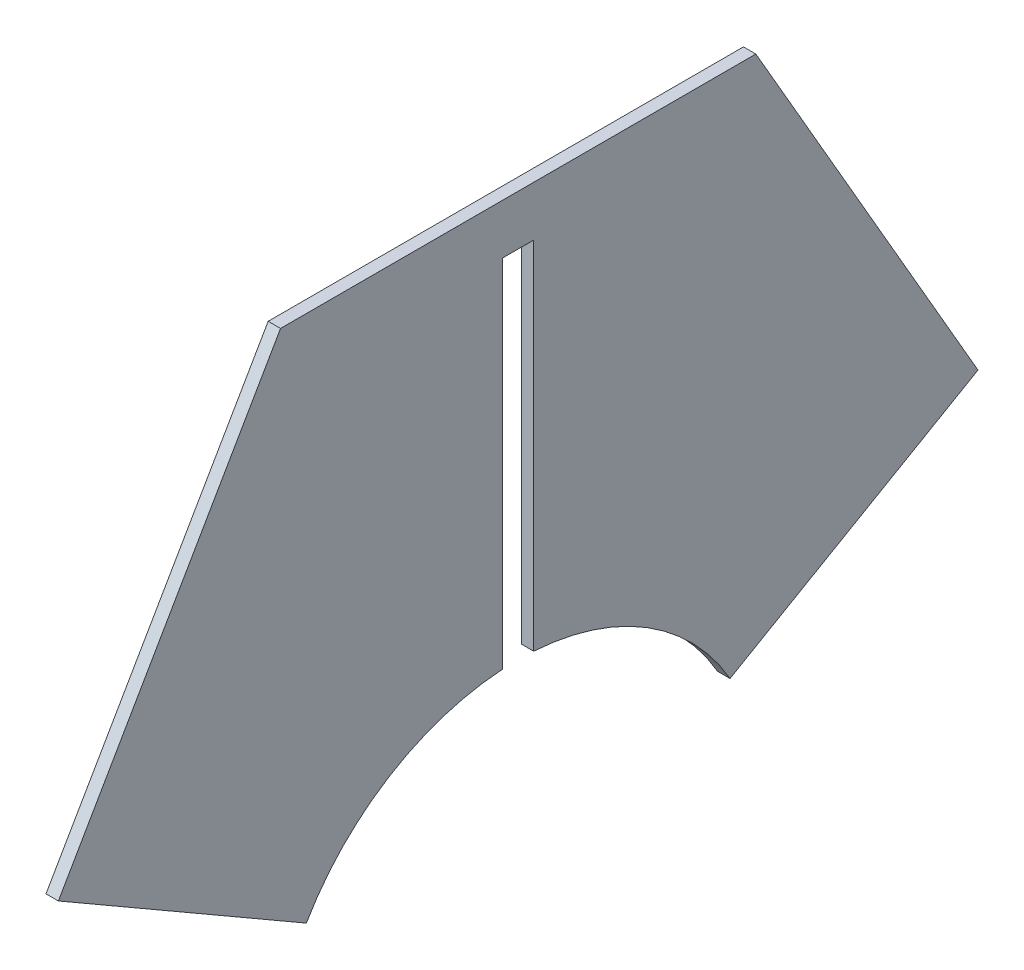
ISO-10303-21;
HEADER;
FILE_DESCRIPTION(('STEP AP214'),'2;1');
FILE_NAME('part.step','',(''),(''),'','','');
FILE_SCHEMA(('AUTOMOTIVE_DESIGN { 1 0 10303 214 1 1 1 1 }'));
ENDSEC;
DATA;
#1=APPLICATION_CONTEXT('core data for automotive mechanical design processes');
#2=APPLICATION_PROTOCOL_DEFINITION('international standard','automotive_design',2000,#1);
#3=PRODUCT_CONTEXT('',#1,'mechanical');
#4=PRODUCT('Part','Part','',(#3));
#5=PRODUCT_RELATED_PRODUCT_CATEGORY('part','',(#4));
#6=PRODUCT_DEFINITION_FORMATION('','',#4);
#7=PRODUCT_DEFINITION_CONTEXT('part definition',#1,'design');
#8=PRODUCT_DEFINITION('design','',#6,#7);
#9=PRODUCT_DEFINITION_SHAPE('','',#8);
#10=(LENGTH_UNIT() NAMED_UNIT(*) SI_UNIT(.MILLI.,.METRE.));
#11=(NAMED_UNIT(*) PLANE_ANGLE_UNIT() SI_UNIT($,.RADIAN.));
#12=(NAMED_UNIT(*) SI_UNIT($,.STERADIAN.) SOLID_ANGLE_UNIT());
#13=UNCERTAINTY_MEASURE_WITH_UNIT(LENGTH_MEASURE(1.E-05),#10,'distance_accuracy_value','');
#14=(GEOMETRIC_REPRESENTATION_CONTEXT(3) GLOBAL_UNCERTAINTY_ASSIGNED_CONTEXT((#13)) GLOBAL_UNIT_ASSIGNED_CONTEXT((#10,
#11,#12)) REPRESENTATION_CONTEXT('',''));
#15=CARTESIAN_POINT('',(0.,0.,0.));
#16=DIRECTION('',(0.,0.,1.));
#17=DIRECTION('',(1.,0.,0.));
#18=AXIS2_PLACEMENT_3D('',#15,#16,#17);
#19=CARTESIAN_POINT('',(4.,0.,0.));
#20=DIRECTION('',(-1.,0.,0.));
#21=DIRECTION('',(0.,0.,1.));
#22=AXIS2_PLACEMENT_3D('',#19,#20,#21);
#23=CYLINDRICAL_SURFACE('',#22,79.);
#24=CARTESIAN_POINT('',(0.,0.,0.));
#25=DIRECTION('',(-1.,0.,0.));
#26=DIRECTION('',(0.,0.,1.));
#27=AXIS2_PLACEMENT_3D('',#24,#25,#26);
#28=CIRCLE('',#27,79.);
#29=CARTESIAN_POINT('',(0.,39.5000000000003,68.4160068989705));
#30=VERTEX_POINT('',#29);
#31=CARTESIAN_POINT('',(0.,78.8416133777081,5.));
#32=VERTEX_POINT('',#31);
#33=EDGE_CURVE('E142',#30,#32,#28,.T.);
#34=ORIENTED_EDGE('',*,*,#33,.T.);
#35=DIRECTION('',(-1.,0.,0.));
#36=VECTOR('',#35,1.);
#37=CARTESIAN_POINT('',(4.,78.8416133777081,5.));
#38=LINE('',#37,#36);
#39=CARTESIAN_POINT('',(4.,78.8416133777081,5.));
#40=VERTEX_POINT('',#39);
#41=EDGE_CURVE('E11',#40,#32,#38,.T.);
#42=ORIENTED_EDGE('',*,*,#41,.F.);
#43=CARTESIAN_POINT('',(4.,0.,0.));
#44=DIRECTION('',(-1.,0.,0.));
#45=DIRECTION('',(0.,0.,1.));
#46=AXIS2_PLACEMENT_3D('',#43,#44,#45);
#47=CIRCLE('',#46,79.);
#48=CARTESIAN_POINT('',(4.,39.5000000000003,68.4160068989705));
#49=VERTEX_POINT('',#48);
#50=EDGE_CURVE('E160',#49,#40,#47,.T.);
#51=ORIENTED_EDGE('',*,*,#50,.F.);
#52=DIRECTION('',(-1.,0.,0.));
#53=VECTOR('',#52,1.);
#54=CARTESIAN_POINT('',(4.,39.5000000000003,68.4160068989705));
#55=LINE('',#54,#53);
#56=EDGE_CURVE('E138',#49,#30,#55,.T.);
#57=ORIENTED_EDGE('',*,*,#56,.T.);
#58=EDGE_LOOP('',(#34,#42,#51,#57));
#59=FACE_BOUND('',#58,.T.);
#60=ADVANCED_FACE('F34',(#59),#23,.F.);
#61=CARTESIAN_POINT('',(4.,78.8416133777081,5.));
#62=DIRECTION('',(0.,0.,1.));
#63=DIRECTION('',(1.,0.,0.));
#64=AXIS2_PLACEMENT_3D('',#61,#62,#63);
#65=PLANE('',#64);
#66=DIRECTION('',(0.,1.,0.));
#67=VECTOR('',#66,1.);
#68=CARTESIAN_POINT('',(0.,78.8416133777081,5.));
#69=LINE('',#68,#67);
#70=CARTESIAN_POINT('',(0.,193.841613377708,5.));
#71=VERTEX_POINT('',#70);
#72=EDGE_CURVE('E145',#32,#71,#69,.T.);
#73=ORIENTED_EDGE('',*,*,#72,.T.);
#74=DIRECTION('',(-1.,0.,0.));
#75=VECTOR('',#74,1.);
#76=CARTESIAN_POINT('',(4.,193.841613377708,5.));
#77=LINE('',#76,#75);
#78=CARTESIAN_POINT('',(4.,193.841613377708,5.));
#79=VERTEX_POINT('',#78);
#80=EDGE_CURVE('E42',#79,#71,#77,.T.);
#81=ORIENTED_EDGE('',*,*,#80,.F.);
#82=DIRECTION('',(0.,1.,0.));
#83=VECTOR('',#82,1.);
#84=CARTESIAN_POINT('',(4.,78.8416133777081,5.));
#85=LINE('',#84,#83);
#86=EDGE_CURVE('E99',#40,#79,#85,.T.);
#87=ORIENTED_EDGE('',*,*,#86,.F.);
#88=ORIENTED_EDGE('',*,*,#41,.T.);
#89=EDGE_LOOP('',(#73,#81,#87,#88));
#90=FACE_BOUND('',#89,.T.);
#91=ADVANCED_FACE('F209',(#90),#65,.F.);
#92=CARTESIAN_POINT('',(4.,193.841613377708,5.));
#93=DIRECTION('',(0.,1.,0.));
#94=DIRECTION('',(0.,0.,1.));
#95=AXIS2_PLACEMENT_3D('',#92,#93,#94);
#96=PLANE('',#95);
#97=DIRECTION('',(0.,0.,-1.));
#98=VECTOR('',#97,1.);
#99=CARTESIAN_POINT('',(0.,193.841613377708,5.));
#100=LINE('',#99,#98);
#101=CARTESIAN_POINT('',(0.,193.841613377708,-5.));
#102=VERTEX_POINT('',#101);
#103=EDGE_CURVE('E147',#71,#102,#100,.T.);
#104=ORIENTED_EDGE('',*,*,#103,.T.);
#105=DIRECTION('',(-1.,0.,0.));
#106=VECTOR('',#105,1.);
#107=CARTESIAN_POINT('',(4.,193.841613377708,-5.));
#108=LINE('',#107,#106);
#109=CARTESIAN_POINT('',(4.,193.841613377708,-5.));
#110=VERTEX_POINT('',#109);
#111=EDGE_CURVE('E173',#110,#102,#108,.T.);
#112=ORIENTED_EDGE('',*,*,#111,.F.);
#113=DIRECTION('',(0.,0.,-1.));
#114=VECTOR('',#113,1.);
#115=CARTESIAN_POINT('',(4.,193.841613377708,5.));
#116=LINE('',#115,#114);
#117=EDGE_CURVE('E181',#79,#110,#116,.T.);
#118=ORIENTED_EDGE('',*,*,#117,.F.);
#119=ORIENTED_EDGE('',*,*,#80,.T.);
#120=EDGE_LOOP('',(#104,#112,#118,#119));
#121=FACE_BOUND('',#120,.T.);
#122=ADVANCED_FACE('F179',(#121),#96,.F.);
#123=CARTESIAN_POINT('',(4.,193.841613377708,-5.));
#124=DIRECTION('',(0.,0.,-1.));
#125=DIRECTION('',(-1.,0.,0.));
#126=AXIS2_PLACEMENT_3D('',#123,#124,#125);
#127=PLANE('',#126);
#128=DIRECTION('',(0.,-1.,0.));
#129=VECTOR('',#128,1.);
#130=CARTESIAN_POINT('',(0.,193.841613377708,-5.));
#131=LINE('',#130,#129);
#132=CARTESIAN_POINT('',(0.,78.8416133777081,-5.));
#133=VERTEX_POINT('',#132);
#134=EDGE_CURVE('E149',#102,#133,#131,.T.);
#135=ORIENTED_EDGE('',*,*,#134,.T.);
#136=DIRECTION('',(-1.,0.,0.));
#137=VECTOR('',#136,1.);
#138=CARTESIAN_POINT('',(4.,78.8416133777081,-5.));
#139=LINE('',#138,#137);
#140=CARTESIAN_POINT('',(4.,78.8416133777081,-5.));
#141=VERTEX_POINT('',#140);
#142=EDGE_CURVE('E170',#141,#133,#139,.T.);
#143=ORIENTED_EDGE('',*,*,#142,.F.);
#144=DIRECTION('',(0.,-1.,0.));
#145=VECTOR('',#144,1.);
#146=CARTESIAN_POINT('',(4.,193.841613377708,-5.));
#147=LINE('',#146,#145);
#148=EDGE_CURVE('E199',#110,#141,#147,.T.);
#149=ORIENTED_EDGE('',*,*,#148,.F.);
#150=ORIENTED_EDGE('',*,*,#111,.T.);
#151=EDGE_LOOP('',(#135,#143,#149,#150));
#152=FACE_BOUND('',#151,.T.);
#153=ADVANCED_FACE('F190',(#152),#127,.F.);
#154=CARTESIAN_POINT('',(4.,0.,0.));
#155=DIRECTION('',(-1.,0.,0.));
#156=DIRECTION('',(0.,0.,1.));
#157=AXIS2_PLACEMENT_3D('',#154,#155,#156);
#158=CYLINDRICAL_SURFACE('',#157,79.);
#159=CARTESIAN_POINT('',(0.,0.,0.));
#160=DIRECTION('',(-1.,0.,0.));
#161=DIRECTION('',(0.,0.,-1.));
#162=AXIS2_PLACEMENT_3D('',#159,#160,#161);
#163=CIRCLE('',#162,79.);
#164=CARTESIAN_POINT('',(0.,39.4999999999998,-68.4160068989707));
#165=VERTEX_POINT('',#164);
#166=EDGE_CURVE('E151',#133,#165,#163,.T.);
#167=ORIENTED_EDGE('',*,*,#166,.T.);
#168=DIRECTION('',(-1.,0.,0.));
#169=VECTOR('',#168,1.);
#170=CARTESIAN_POINT('',(4.,39.4999999999998,-68.4160068989707));
#171=LINE('',#170,#169);
#172=CARTESIAN_POINT('',(4.,39.4999999999998,-68.4160068989707));
#173=VERTEX_POINT('',#172);
#174=EDGE_CURVE('E167',#173,#165,#171,.T.);
#175=ORIENTED_EDGE('',*,*,#174,.F.);
#176=CARTESIAN_POINT('',(4.,0.,0.));
#177=DIRECTION('',(-1.,0.,0.));
#178=DIRECTION('',(0.,0.,-1.));
#179=AXIS2_PLACEMENT_3D('',#176,#177,#178);
#180=CIRCLE('',#179,79.);
#181=EDGE_CURVE('E196',#141,#173,#180,.T.);
#182=ORIENTED_EDGE('',*,*,#181,.F.);
#183=ORIENTED_EDGE('',*,*,#142,.T.);
#184=EDGE_LOOP('',(#167,#175,#182,#183));
#185=FACE_BOUND('',#184,.T.);
#186=ADVANCED_FACE('F194',(#185),#158,.F.);
#187=CARTESIAN_POINT('',(4.,85.7365149746589,-148.5));
#188=DIRECTION('',(0.,0.86602540378444,0.499999999999998));
#189=DIRECTION('',(0.,-0.499999999999998,0.86602540378444));
#190=AXIS2_PLACEMENT_3D('',#187,#188,#189);
#191=PLANE('',#190);
#192=DIRECTION('',(0.,0.499999999999998,-0.86602540378444));
#193=VECTOR('',#192,1.);
#194=CARTESIAN_POINT('',(0.,85.7365149746589,-148.5));
#195=LINE('',#194,#193);
#196=CARTESIAN_POINT('',(0.,85.7365149746589,-148.5));
#197=VERTEX_POINT('',#196);
#198=EDGE_CURVE('E153',#165,#197,#195,.T.);
#199=ORIENTED_EDGE('',*,*,#198,.T.);
#200=DIRECTION('',(-1.,0.,0.));
#201=VECTOR('',#200,1.);
#202=CARTESIAN_POINT('',(4.,85.7365149746589,-148.5));
#203=LINE('',#202,#201);
#204=CARTESIAN_POINT('',(4.,85.7365149746589,-148.5));
#205=VERTEX_POINT('',#204);
#206=EDGE_CURVE('E164',#205,#197,#203,.T.);
#207=ORIENTED_EDGE('',*,*,#206,.F.);
#208=DIRECTION('',(0.,0.499999999999998,-0.86602540378444));
#209=VECTOR('',#208,1.);
#210=CARTESIAN_POINT('',(4.,85.7365149746589,-148.5));
#211=LINE('',#210,#209);
#212=EDGE_CURVE('E198',#173,#205,#211,.T.);
#213=ORIENTED_EDGE('',*,*,#212,.F.);
#214=ORIENTED_EDGE('',*,*,#174,.T.);
#215=EDGE_LOOP('',(#199,#207,#213,#214));
#216=FACE_BOUND('',#215,.T.);
#217=ADVANCED_FACE('F221',(#216),#191,.F.);
#218=CARTESIAN_POINT('',(4.,210.,-76.7564434701784));
#219=DIRECTION('',(0.,-0.499999999999998,0.86602540378444));
#220=DIRECTION('',(0.,-0.86602540378444,-0.499999999999998));
#221=AXIS2_PLACEMENT_3D('',#218,#219,#220);
#222=PLANE('',#221);
#223=DIRECTION('',(0.,0.86602540378444,0.499999999999998));
#224=VECTOR('',#223,1.);
#225=CARTESIAN_POINT('',(0.,210.,-76.7564434701784));
#226=LINE('',#225,#224);
#227=CARTESIAN_POINT('',(0.,210.,-76.7564434701784));
#228=VERTEX_POINT('',#227);
#229=EDGE_CURVE('E155',#197,#228,#226,.T.);
#230=ORIENTED_EDGE('',*,*,#229,.T.);
#231=DIRECTION('',(-1.,0.,0.));
#232=VECTOR('',#231,1.);
#233=CARTESIAN_POINT('',(4.,210.,-76.7564434701784));
#234=LINE('',#233,#232);
#235=CARTESIAN_POINT('',(4.,210.,-76.7564434701784));
#236=VERTEX_POINT('',#235);
#237=EDGE_CURVE('E133',#236,#228,#234,.T.);
#238=ORIENTED_EDGE('',*,*,#237,.F.);
#239=DIRECTION('',(0.,0.86602540378444,0.499999999999998));
#240=VECTOR('',#239,1.);
#241=CARTESIAN_POINT('',(4.,210.,-76.7564434701784));
#242=LINE('',#241,#240);
#243=EDGE_CURVE('E124',#205,#236,#242,.T.);
#244=ORIENTED_EDGE('',*,*,#243,.F.);
#245=ORIENTED_EDGE('',*,*,#206,.T.);
#246=EDGE_LOOP('',(#230,#238,#244,#245));
#247=FACE_BOUND('',#246,.T.);
#248=ADVANCED_FACE('F224',(#247),#222,.F.);
#249=CARTESIAN_POINT('',(4.,210.,76.7564434701784));
#250=DIRECTION('',(0.,-1.,0.));
#251=DIRECTION('',(0.,0.,-1.));
#252=AXIS2_PLACEMENT_3D('',#249,#250,#251);
#253=PLANE('',#252);
#254=DIRECTION('',(0.,0.,1.));
#255=VECTOR('',#254,1.);
#256=CARTESIAN_POINT('',(0.,210.,76.7564434701784));
#257=LINE('',#256,#255);
#258=CARTESIAN_POINT('',(0.,210.,76.7564434701784));
#259=VERTEX_POINT('',#258);
#260=EDGE_CURVE('E132',#228,#259,#257,.T.);
#261=ORIENTED_EDGE('',*,*,#260,.T.);
#262=DIRECTION('',(-1.,0.,0.));
#263=VECTOR('',#262,1.);
#264=CARTESIAN_POINT('',(4.,210.,76.7564434701784));
#265=LINE('',#264,#263);
#266=CARTESIAN_POINT('',(4.,210.,76.7564434701784));
#267=VERTEX_POINT('',#266);
#268=EDGE_CURVE('E129',#267,#259,#265,.T.);
#269=ORIENTED_EDGE('',*,*,#268,.F.);
#270=DIRECTION('',(0.,0.,1.));
#271=VECTOR('',#270,1.);
#272=CARTESIAN_POINT('',(4.,210.,76.7564434701784));
#273=LINE('',#272,#271);
#274=EDGE_CURVE('E118',#236,#267,#273,.T.);
#275=ORIENTED_EDGE('',*,*,#274,.F.);
#276=ORIENTED_EDGE('',*,*,#237,.T.);
#277=EDGE_LOOP('',(#261,#269,#275,#276));
#278=FACE_BOUND('',#277,.T.);
#279=ADVANCED_FACE('F130',(#278),#253,.F.);
#280=CARTESIAN_POINT('',(4.,85.7365149746603,148.5));
#281=DIRECTION('',(0.,-0.500000000000004,-0.866025403784436));
#282=DIRECTION('',(0.,0.866025403784436,-0.500000000000004));
#283=AXIS2_PLACEMENT_3D('',#280,#281,#282);
#284=PLANE('',#283);
#285=DIRECTION('',(0.,-0.866025403784436,0.500000000000004));
#286=VECTOR('',#285,1.);
#287=CARTESIAN_POINT('',(0.,85.7365149746603,148.5));
#288=LINE('',#287,#286);
#289=CARTESIAN_POINT('',(0.,85.7365149746603,148.5));
#290=VERTEX_POINT('',#289);
#291=EDGE_CURVE('E85',#259,#290,#288,.T.);
#292=ORIENTED_EDGE('',*,*,#291,.T.);
#293=DIRECTION('',(-1.,0.,0.));
#294=VECTOR('',#293,1.);
#295=CARTESIAN_POINT('',(4.,85.7365149746603,148.5));
#296=LINE('',#295,#294);
#297=CARTESIAN_POINT('',(4.,85.7365149746603,148.5));
#298=VERTEX_POINT('',#297);
#299=EDGE_CURVE('E134',#298,#290,#296,.T.);
#300=ORIENTED_EDGE('',*,*,#299,.F.);
#301=DIRECTION('',(0.,-0.866025403784436,0.500000000000004));
#302=VECTOR('',#301,1.);
#303=CARTESIAN_POINT('',(4.,85.7365149746603,148.5));
#304=LINE('',#303,#302);
#305=EDGE_CURVE('E122',#267,#298,#304,.T.);
#306=ORIENTED_EDGE('',*,*,#305,.F.);
#307=ORIENTED_EDGE('',*,*,#268,.T.);
#308=EDGE_LOOP('',(#292,#300,#306,#307));
#309=FACE_BOUND('',#308,.T.);
#310=ADVANCED_FACE('F136',(#309),#284,.F.);
#311=CARTESIAN_POINT('',(4.,39.5000000000003,68.4160068989705));
#312=DIRECTION('',(0.,0.866025403784436,-0.500000000000004));
#313=DIRECTION('',(0.,0.500000000000004,0.866025403784436));
#314=AXIS2_PLACEMENT_3D('',#311,#312,#313);
#315=PLANE('',#314);
#316=DIRECTION('',(0.,-0.500000000000004,-0.866025403784436));
#317=VECTOR('',#316,1.);
#318=CARTESIAN_POINT('',(0.,39.5000000000003,68.4160068989705));
#319=LINE('',#318,#317);
#320=EDGE_CURVE('E91',#290,#30,#319,.T.);
#321=ORIENTED_EDGE('',*,*,#320,.T.);
#322=ORIENTED_EDGE('',*,*,#56,.F.);
#323=DIRECTION('',(0.,-0.500000000000004,-0.866025403784436));
#324=VECTOR('',#323,1.);
#325=CARTESIAN_POINT('',(4.,39.5000000000003,68.4160068989705));
#326=LINE('',#325,#324);
#327=EDGE_CURVE('E50',#298,#49,#326,.T.);
#328=ORIENTED_EDGE('',*,*,#327,.F.);
#329=ORIENTED_EDGE('',*,*,#299,.T.);
#330=EDGE_LOOP('',(#321,#322,#328,#329));
#331=FACE_BOUND('',#330,.T.);
#332=ADVANCED_FACE('F233',(#331),#315,.F.);
#333=CARTESIAN_POINT('',(4.,0.,0.));
#334=DIRECTION('',(-1.,0.,0.));
#335=DIRECTION('',(0.,0.,1.));
#336=AXIS2_PLACEMENT_3D('',#333,#334,#335);
#337=PLANE('',#336);
#338=ORIENTED_EDGE('',*,*,#50,.T.);
#339=ORIENTED_EDGE('',*,*,#86,.T.);
#340=ORIENTED_EDGE('',*,*,#117,.T.);
#341=ORIENTED_EDGE('',*,*,#148,.T.);
#342=ORIENTED_EDGE('',*,*,#181,.T.);
#343=ORIENTED_EDGE('',*,*,#212,.T.);
#344=ORIENTED_EDGE('',*,*,#243,.T.);
#345=ORIENTED_EDGE('',*,*,#274,.T.);
#346=ORIENTED_EDGE('',*,*,#305,.T.);
#347=ORIENTED_EDGE('',*,*,#327,.T.);
#348=EDGE_LOOP('',(#338,#339,#340,#341,#342,#343,#344,#345,#346,#347));
#349=FACE_BOUND('',#348,.T.);
#350=ADVANCED_FACE('F120',(#349),#337,.F.);
#351=CARTESIAN_POINT('',(0.,0.,0.));
#352=DIRECTION('',(-1.,0.,0.));
#353=DIRECTION('',(0.,0.,1.));
#354=AXIS2_PLACEMENT_3D('',#351,#352,#353);
#355=PLANE('',#354);
#356=ORIENTED_EDGE('',*,*,#33,.F.);
#357=ORIENTED_EDGE('',*,*,#320,.F.);
#358=ORIENTED_EDGE('',*,*,#291,.F.);
#359=ORIENTED_EDGE('',*,*,#260,.F.);
#360=ORIENTED_EDGE('',*,*,#229,.F.);
#361=ORIENTED_EDGE('',*,*,#198,.F.);
#362=ORIENTED_EDGE('',*,*,#166,.F.);
#363=ORIENTED_EDGE('',*,*,#134,.F.);
#364=ORIENTED_EDGE('',*,*,#103,.F.);
#365=ORIENTED_EDGE('',*,*,#72,.F.);
#366=EDGE_LOOP('',(#356,#357,#358,#359,#360,#361,#362,#363,#364,#365));
#367=FACE_BOUND('',#366,.T.);
#368=ADVANCED_FACE('F185',(#367),#355,.T.);
#369=CLOSED_SHELL('',(#60,#91,#122,#153,#186,#217,#248,#279,#310,#332,#350,#368));
#370=MANIFOLD_SOLID_BREP('B2',#369);
#371=ADVANCED_BREP_SHAPE_REPRESENTATION('',(#18,#370),#14);
#372=SHAPE_DEFINITION_REPRESENTATION(#9,#371);
ENDSEC;
END-ISO-10303-21;
